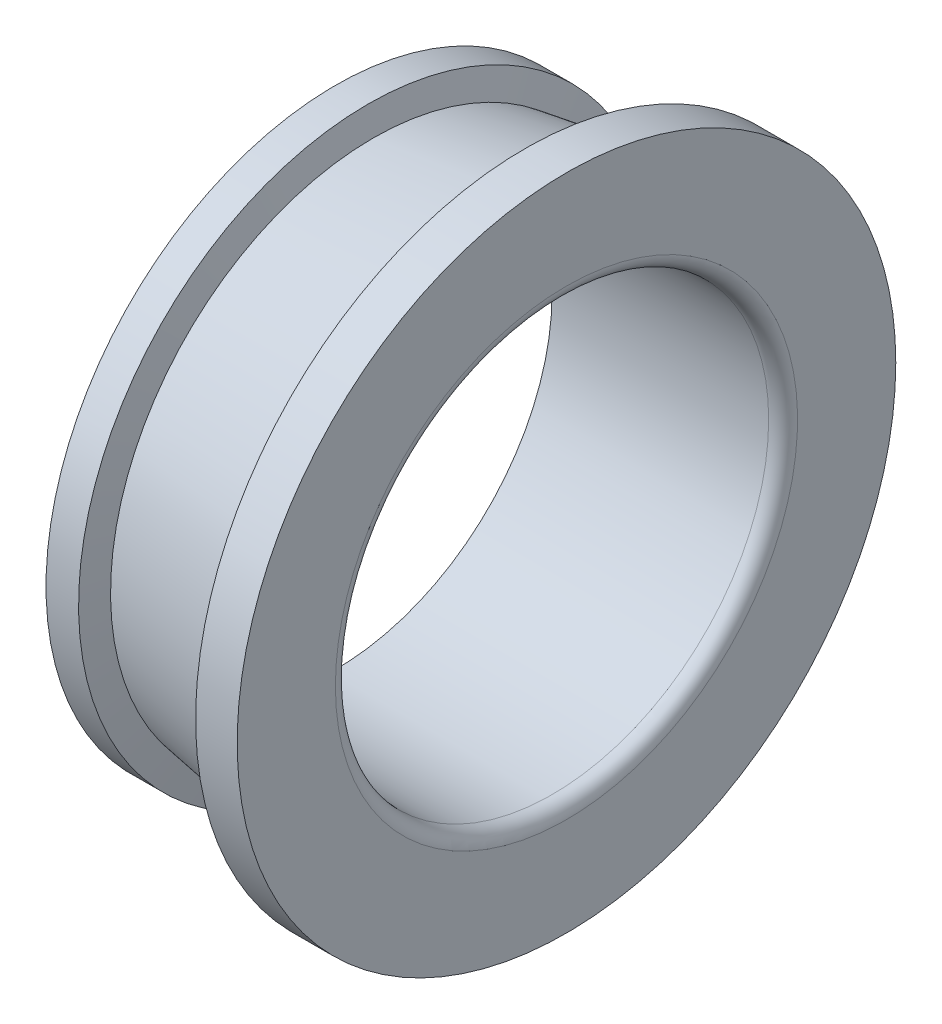
ISO-10303-21;
HEADER;
FILE_DESCRIPTION(('STEP AP214'),'2;1');
FILE_NAME('part.step','',(''),(''),'','','');
FILE_SCHEMA(('AUTOMOTIVE_DESIGN { 1 0 10303 214 1 1 1 1 }'));
ENDSEC;
DATA;
#1=APPLICATION_CONTEXT('core data for automotive mechanical design processes');
#2=APPLICATION_PROTOCOL_DEFINITION('international standard','automotive_design',2000,#1);
#3=PRODUCT_CONTEXT('',#1,'mechanical');
#4=PRODUCT('Part','Part','',(#3));
#5=PRODUCT_RELATED_PRODUCT_CATEGORY('part','',(#4));
#6=PRODUCT_DEFINITION_FORMATION('','',#4);
#7=PRODUCT_DEFINITION_CONTEXT('part definition',#1,'design');
#8=PRODUCT_DEFINITION('design','',#6,#7);
#9=PRODUCT_DEFINITION_SHAPE('','',#8);
#10=(LENGTH_UNIT() NAMED_UNIT(*) SI_UNIT(.MILLI.,.METRE.));
#11=(NAMED_UNIT(*) PLANE_ANGLE_UNIT() SI_UNIT($,.RADIAN.));
#12=(NAMED_UNIT(*) SI_UNIT($,.STERADIAN.) SOLID_ANGLE_UNIT());
#13=UNCERTAINTY_MEASURE_WITH_UNIT(LENGTH_MEASURE(1.E-05),#10,'distance_accuracy_value','');
#14=(GEOMETRIC_REPRESENTATION_CONTEXT(3) GLOBAL_UNCERTAINTY_ASSIGNED_CONTEXT((#13)) GLOBAL_UNIT_ASSIGNED_CONTEXT((#10,
#11,#12)) REPRESENTATION_CONTEXT('',''));
#15=CARTESIAN_POINT('',(0.,0.,0.));
#16=DIRECTION('',(0.,0.,1.));
#17=DIRECTION('',(1.,0.,0.));
#18=AXIS2_PLACEMENT_3D('',#15,#16,#17);
#19=CARTESIAN_POINT('',(4.4375,0.,0.));
#20=DIRECTION('',(1.,0.,0.));
#21=DIRECTION('',(0.,0.,-1.));
#22=AXIS2_PLACEMENT_3D('',#19,#20,#21);
#23=CYLINDRICAL_SURFACE('',#22,20.034);
#24=CARTESIAN_POINT('',(3.50198343607805,0.,0.));
#25=DIRECTION('',(-1.,0.,0.));
#26=DIRECTION('',(0.,1.,0.));
#27=AXIS2_PLACEMENT_3D('',#24,#25,#26);
#28=CIRCLE('',#27,20.034);
#29=CARTESIAN_POINT('',(3.50198343607804,20.034,0.));
#30=VERTEX_POINT('',#29);
#31=EDGE_CURVE('E28',#30,#30,#28,.T.);
#32=ORIENTED_EDGE('',*,*,#31,.T.);
#33=EDGE_LOOP('',(#32));
#34=FACE_BOUND('',#33,.T.);
#35=CARTESIAN_POINT('',(1.25,0.,0.));
#36=DIRECTION('',(1.,0.,0.));
#37=DIRECTION('',(0.,0.,-1.));
#38=AXIS2_PLACEMENT_3D('',#35,#36,#37);
#39=CIRCLE('',#38,20.034);
#40=CARTESIAN_POINT('',(1.25,0.,-20.034));
#41=VERTEX_POINT('',#40);
#42=EDGE_CURVE('E17',#41,#41,#39,.F.);
#43=ORIENTED_EDGE('',*,*,#42,.F.);
#44=EDGE_LOOP('',(#43));
#45=FACE_BOUND('',#44,.T.);
#46=ADVANCED_FACE('F14',(#34,#45),#23,.T.);
#47=CARTESIAN_POINT('',(3.86671228372693,0.,0.));
#48=DIRECTION('',(-1.,0.,0.));
#49=DIRECTION('',(0.,-1.,0.));
#50=AXIS2_PLACEMENT_3D('',#47,#48,#49);
#51=CONICAL_SURFACE('',#50,18.1841418411685,1.3761273949946);
#52=ORIENTED_EDGE('',*,*,#31,.F.);
#53=EDGE_LOOP('',(#52));
#54=FACE_BOUND('',#53,.T.);
#55=CARTESIAN_POINT('',(3.86671228372693,0.,0.));
#56=DIRECTION('',(1.,0.,0.));
#57=DIRECTION('',(0.,1.,0.));
#58=AXIS2_PLACEMENT_3D('',#55,#56,#57);
#59=CIRCLE('',#58,18.1841418411685);
#60=CARTESIAN_POINT('',(3.86671228372691,18.1841418411685,0.));
#61=VERTEX_POINT('',#60);
#62=EDGE_CURVE('E33',#61,#61,#59,.F.);
#63=ORIENTED_EDGE('',*,*,#62,.T.);
#64=EDGE_LOOP('',(#63));
#65=FACE_BOUND('',#64,.T.);
#66=ADVANCED_FACE('F106',(#54,#65),#51,.T.);
#67=CARTESIAN_POINT('',(1.25,0.,17.517));
#68=DIRECTION('',(-1.,0.,0.));
#69=DIRECTION('',(0.,0.,1.));
#70=AXIS2_PLACEMENT_3D('',#67,#68,#69);
#71=PLANE('',#70);
#72=CARTESIAN_POINT('',(1.25,0.,0.));
#73=DIRECTION('',(1.,0.,0.));
#74=DIRECTION('',(0.,0.,-1.));
#75=AXIS2_PLACEMENT_3D('',#72,#73,#74);
#76=CIRCLE('',#75,15.);
#77=CARTESIAN_POINT('',(1.25,0.,-15.));
#78=VERTEX_POINT('',#77);
#79=EDGE_CURVE('E30',#78,#78,#76,.F.);
#80=ORIENTED_EDGE('',*,*,#79,.F.);
#81=EDGE_LOOP('',(#80));
#82=FACE_BOUND('',#81,.T.);
#83=ORIENTED_EDGE('',*,*,#42,.T.);
#84=EDGE_LOOP('',(#83));
#85=FACE_BOUND('',#84,.T.);
#86=ADVANCED_FACE('F101',(#82,#85),#71,.T.);
#87=CARTESIAN_POINT('',(3.86671228372692,0.,0.));
#88=DIRECTION('',(1.,0.,0.));
#89=DIRECTION('',(0.,1.,0.));
#90=AXIS2_PLACEMENT_3D('',#87,#88,#89);
#91=CONICAL_SURFACE('',#90,18.1841418411685,0.159762346760407);
#92=ORIENTED_EDGE('',*,*,#62,.F.);
#93=EDGE_LOOP('',(#92));
#94=FACE_BOUND('',#93,.T.);
#95=CARTESIAN_POINT('',(14.9308215615816,0.,0.));
#96=DIRECTION('',(-1.,0.,0.));
#97=DIRECTION('',(0.,1.,0.));
#98=AXIS2_PLACEMENT_3D('',#95,#96,#97);
#99=CIRCLE('',#98,19.9669640330566);
#100=CARTESIAN_POINT('',(14.9308215615816,19.9669640330566,0.));
#101=VERTEX_POINT('',#100);
#102=EDGE_CURVE('E32',#101,#101,#99,.T.);
#103=ORIENTED_EDGE('',*,*,#102,.T.);
#104=EDGE_LOOP('',(#103));
#105=FACE_BOUND('',#104,.T.);
#106=ADVANCED_FACE('F95',(#94,#105),#91,.T.);
#107=CARTESIAN_POINT('',(1.25,0.,0.));
#108=DIRECTION('',(1.,0.,0.));
#109=DIRECTION('',(0.,0.,-1.));
#110=AXIS2_PLACEMENT_3D('',#107,#108,#109);
#111=CYLINDRICAL_SURFACE('',#110,15.);
#112=ORIENTED_EDGE('',*,*,#79,.T.);
#113=EDGE_LOOP('',(#112));
#114=FACE_BOUND('',#113,.T.);
#115=CARTESIAN_POINT('',(16.25,0.,0.));
#116=DIRECTION('',(1.,0.,0.));
#117=DIRECTION('',(0.,1.,0.));
#118=AXIS2_PLACEMENT_3D('',#115,#116,#117);
#119=CIRCLE('',#118,15.);
#120=CARTESIAN_POINT('',(16.25,15.,0.));
#121=VERTEX_POINT('',#120);
#122=EDGE_CURVE('E37',#121,#121,#119,.F.);
#123=ORIENTED_EDGE('',*,*,#122,.F.);
#124=EDGE_LOOP('',(#123));
#125=FACE_BOUND('',#124,.T.);
#126=ADVANCED_FACE('F93',(#114,#125),#111,.F.);
#127=CARTESIAN_POINT('',(14.3722436302749,0.,0.));
#128=DIRECTION('',(-1.,0.,0.));
#129=DIRECTION('',(0.,-1.,0.));
#130=AXIS2_PLACEMENT_3D('',#127,#128,#129);
#131=CONICAL_SURFACE('',#130,22.8,1.3761273949946);
#132=ORIENTED_EDGE('',*,*,#102,.F.);
#133=EDGE_LOOP('',(#132));
#134=FACE_BOUND('',#133,.T.);
#135=CARTESIAN_POINT('',(14.3722436302749,0.,0.));
#136=DIRECTION('',(1.,0.,0.));
#137=DIRECTION('',(0.,0.,-1.));
#138=AXIS2_PLACEMENT_3D('',#135,#136,#137);
#139=CIRCLE('',#138,22.8);
#140=CARTESIAN_POINT('',(14.3722436302749,0.,-22.8));
#141=VERTEX_POINT('',#140);
#142=EDGE_CURVE('E26',#141,#141,#139,.T.);
#143=ORIENTED_EDGE('',*,*,#142,.F.);
#144=EDGE_LOOP('',(#143));
#145=FACE_BOUND('',#144,.T.);
#146=ADVANCED_FACE('F67',(#134,#145),#131,.F.);
#147=CARTESIAN_POINT('',(16.25,0.,0.));
#148=DIRECTION('',(1.,0.,0.));
#149=DIRECTION('',(0.,1.,0.));
#150=AXIS2_PLACEMENT_3D('',#147,#148,#149);
#151=TOROIDAL_SURFACE('',#150,16.,1.);
#152=CARTESIAN_POINT('',(17.25,0.,0.));
#153=DIRECTION('',(1.,0.,0.));
#154=DIRECTION('',(0.,0.,1.));
#155=AXIS2_PLACEMENT_3D('',#152,#153,#154);
#156=CIRCLE('',#155,16.);
#157=CARTESIAN_POINT('',(17.25,0.,16.));
#158=VERTEX_POINT('',#157);
#159=EDGE_CURVE('E21',#158,#158,#156,.F.);
#160=ORIENTED_EDGE('',*,*,#159,.F.);
#161=EDGE_LOOP('',(#160));
#162=FACE_BOUND('',#161,.T.);
#163=ORIENTED_EDGE('',*,*,#122,.T.);
#164=EDGE_LOOP('',(#163));
#165=FACE_BOUND('',#164,.T.);
#166=ADVANCED_FACE('F56',(#162,#165),#151,.T.);
#167=CARTESIAN_POINT('',(12.9375,0.,0.));
#168=DIRECTION('',(1.,0.,0.));
#169=DIRECTION('',(0.,0.,-1.));
#170=AXIS2_PLACEMENT_3D('',#167,#168,#169);
#171=CYLINDRICAL_SURFACE('',#170,22.8);
#172=CARTESIAN_POINT('',(17.25,0.,0.));
#173=DIRECTION('',(1.,0.,0.));
#174=DIRECTION('',(0.,0.,-1.));
#175=AXIS2_PLACEMENT_3D('',#172,#173,#174);
#176=CIRCLE('',#175,22.8);
#177=CARTESIAN_POINT('',(17.25,0.,-22.8));
#178=VERTEX_POINT('',#177);
#179=EDGE_CURVE('E10',#178,#178,#176,.T.);
#180=ORIENTED_EDGE('',*,*,#179,.F.);
#181=EDGE_LOOP('',(#180));
#182=FACE_BOUND('',#181,.T.);
#183=ORIENTED_EDGE('',*,*,#142,.T.);
#184=EDGE_LOOP('',(#183));
#185=FACE_BOUND('',#184,.T.);
#186=ADVANCED_FACE('F66',(#182,#185),#171,.T.);
#187=CARTESIAN_POINT('',(17.25,0.,19.4));
#188=DIRECTION('',(1.,0.,0.));
#189=DIRECTION('',(0.,0.,-1.));
#190=AXIS2_PLACEMENT_3D('',#187,#188,#189);
#191=PLANE('',#190);
#192=ORIENTED_EDGE('',*,*,#179,.T.);
#193=EDGE_LOOP('',(#192));
#194=FACE_BOUND('',#193,.T.);
#195=ORIENTED_EDGE('',*,*,#159,.T.);
#196=EDGE_LOOP('',(#195));
#197=FACE_BOUND('',#196,.T.);
#198=ADVANCED_FACE('F76',(#194,#197),#191,.T.);
#199=CLOSED_SHELL('',(#46,#66,#86,#106,#126,#146,#166,#186,#198));
#200=MANIFOLD_SOLID_BREP('B1',#199);
#201=ADVANCED_BREP_SHAPE_REPRESENTATION('',(#18,#200),#14);
#202=SHAPE_DEFINITION_REPRESENTATION(#9,#201);
ENDSEC;
END-ISO-10303-21;
